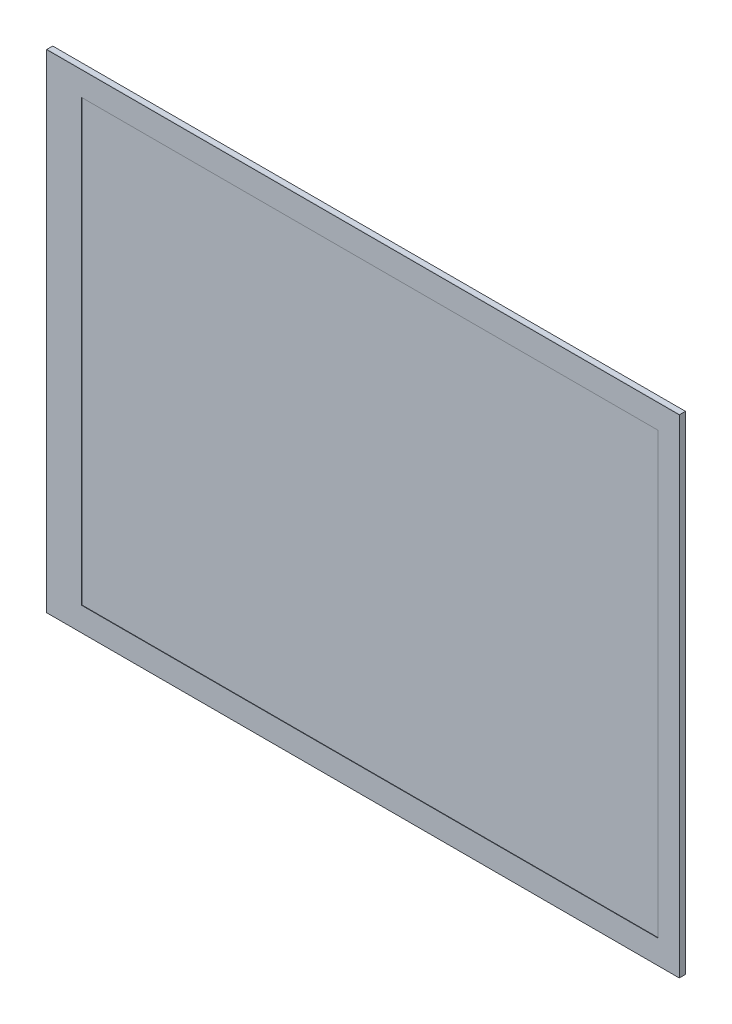
ISO-10303-21;
HEADER;
FILE_DESCRIPTION(('STEP AP214'),'2;1');
FILE_NAME('part.step','',(''),(''),'','','');
FILE_SCHEMA(('AUTOMOTIVE_DESIGN { 1 0 10303 214 1 1 1 1 }'));
ENDSEC;
DATA;
#1=APPLICATION_CONTEXT('core data for automotive mechanical design processes');
#2=APPLICATION_PROTOCOL_DEFINITION('international standard','automotive_design',2000,#1);
#3=PRODUCT_CONTEXT('',#1,'mechanical');
#4=PRODUCT('Part','Part','',(#3));
#5=PRODUCT_RELATED_PRODUCT_CATEGORY('part','',(#4));
#6=PRODUCT_DEFINITION_FORMATION('','',#4);
#7=PRODUCT_DEFINITION_CONTEXT('part definition',#1,'design');
#8=PRODUCT_DEFINITION('design','',#6,#7);
#9=PRODUCT_DEFINITION_SHAPE('','',#8);
#10=(LENGTH_UNIT() NAMED_UNIT(*) SI_UNIT(.MILLI.,.METRE.));
#11=(NAMED_UNIT(*) PLANE_ANGLE_UNIT() SI_UNIT($,.RADIAN.));
#12=(NAMED_UNIT(*) SI_UNIT($,.STERADIAN.) SOLID_ANGLE_UNIT());
#13=UNCERTAINTY_MEASURE_WITH_UNIT(LENGTH_MEASURE(1.E-05),#10,'distance_accuracy_value','');
#14=(GEOMETRIC_REPRESENTATION_CONTEXT(3) GLOBAL_UNCERTAINTY_ASSIGNED_CONTEXT((#13)) GLOBAL_UNIT_ASSIGNED_CONTEXT((#10,
#11,#12)) REPRESENTATION_CONTEXT('',''));
#15=CARTESIAN_POINT('',(0.,0.,0.));
#16=DIRECTION('',(0.,0.,1.));
#17=DIRECTION('',(1.,0.,0.));
#18=AXIS2_PLACEMENT_3D('',#15,#16,#17);
#19=CARTESIAN_POINT('',(0.2,44.5,1.4));
#20=DIRECTION('',(0.,0.,-1.));
#21=DIRECTION('',(-1.,0.,0.));
#22=AXIS2_PLACEMENT_3D('',#19,#20,#21);
#23=PLANE('',#22);
#24=DIRECTION('',(-1.,0.,0.));
#25=VECTOR('',#24,1.);
#26=CARTESIAN_POINT('',(0.2,44.5,1.4));
#27=LINE('',#26,#25);
#28=CARTESIAN_POINT('',(0.2,44.5,1.4));
#29=VERTEX_POINT('',#28);
#30=CARTESIAN_POINT('',(0.1,44.5,1.4));
#31=VERTEX_POINT('',#30);
#32=EDGE_CURVE('E209',#29,#31,#27,.T.);
#33=ORIENTED_EDGE('',*,*,#32,.F.);
#34=DIRECTION('',(0.,1.,0.));
#35=VECTOR('',#34,1.);
#36=CARTESIAN_POINT('',(0.2,66.5,1.4));
#37=LINE('',#36,#35);
#38=CARTESIAN_POINT('',(0.2,66.5,1.4));
#39=VERTEX_POINT('',#38);
#40=EDGE_CURVE('E12',#29,#39,#37,.T.);
#41=ORIENTED_EDGE('',*,*,#40,.T.);
#42=DIRECTION('',(-1.,0.,0.));
#43=VECTOR('',#42,1.);
#44=CARTESIAN_POINT('',(0.2,66.5,1.4));
#45=LINE('',#44,#43);
#46=CARTESIAN_POINT('',(0.1,66.5,1.4));
#47=VERTEX_POINT('',#46);
#48=EDGE_CURVE('E47',#39,#47,#45,.T.);
#49=ORIENTED_EDGE('',*,*,#48,.T.);
#50=DIRECTION('',(0.,1.,0.));
#51=VECTOR('',#50,1.);
#52=CARTESIAN_POINT('',(0.1,111.,1.4));
#53=LINE('',#52,#51);
#54=EDGE_CURVE('E231',#31,#47,#53,.T.);
#55=ORIENTED_EDGE('',*,*,#54,.F.);
#56=EDGE_LOOP('',(#33,#41,#49,#55));
#57=FACE_BOUND('',#56,.T.);
#58=ADVANCED_FACE('F44',(#57),#23,.F.);
#59=CARTESIAN_POINT('',(0.1,111.,1.4));
#60=DIRECTION('',(1.,0.,0.));
#61=DIRECTION('',(0.,0.,-1.));
#62=AXIS2_PLACEMENT_3D('',#59,#60,#61);
#63=PLANE('',#62);
#64=DIRECTION('',(0.,0.,1.));
#65=VECTOR('',#64,1.);
#66=CARTESIAN_POINT('',(0.1,44.5,1.4));
#67=LINE('',#66,#65);
#68=CARTESIAN_POINT('',(0.10000000000001,44.5000000000001,-1.6));
#69=VERTEX_POINT('',#68);
#70=EDGE_CURVE('E152',#69,#31,#67,.T.);
#71=ORIENTED_EDGE('',*,*,#70,.T.);
#72=ORIENTED_EDGE('',*,*,#54,.T.);
#73=DIRECTION('',(0.,0.,-1.));
#74=VECTOR('',#73,1.);
#75=CARTESIAN_POINT('',(0.1,66.5,1.4));
#76=LINE('',#75,#74);
#77=CARTESIAN_POINT('',(0.10000000000001,66.5000000000001,-1.6));
#78=VERTEX_POINT('',#77);
#79=EDGE_CURVE('E184',#47,#78,#76,.T.);
#80=ORIENTED_EDGE('',*,*,#79,.T.);
#81=CARTESIAN_POINT('',(0.10000000000001,65.5000000000001,-1.6));
#82=DIRECTION('',(-1.,0.,0.));
#83=DIRECTION('',(0.,0.,-1.));
#84=AXIS2_PLACEMENT_3D('',#81,#82,#83);
#85=CIRCLE('',#84,1.);
#86=CARTESIAN_POINT('',(0.100000000000014,65.5000000000001,-2.6));
#87=VERTEX_POINT('',#86);
#88=EDGE_CURVE('E139',#78,#87,#85,.T.);
#89=ORIENTED_EDGE('',*,*,#88,.T.);
#90=DIRECTION('',(0.,-1.,0.));
#91=VECTOR('',#90,1.);
#92=CARTESIAN_POINT('',(0.100000000000014,65.5000000000001,-2.59999999999999));
#93=LINE('',#92,#91);
#94=CARTESIAN_POINT('',(0.100000000000014,59.0000000000001,-2.6));
#95=VERTEX_POINT('',#94);
#96=EDGE_CURVE('E183',#87,#95,#93,.T.);
#97=ORIENTED_EDGE('',*,*,#96,.T.);
#98=CARTESIAN_POINT('',(0.100000000000018,59.0000000000001,-3.6));
#99=DIRECTION('',(1.,0.,0.));
#100=DIRECTION('',(0.,0.,1.));
#101=AXIS2_PLACEMENT_3D('',#98,#99,#100);
#102=CIRCLE('',#101,1.);
#103=CARTESIAN_POINT('',(0.100000000000018,58.0000000000001,-3.6));
#104=VERTEX_POINT('',#103);
#105=EDGE_CURVE('E187',#95,#104,#102,.T.);
#106=ORIENTED_EDGE('',*,*,#105,.T.);
#107=DIRECTION('',(0.,0.,-1.));
#108=VECTOR('',#107,1.);
#109=CARTESIAN_POINT('',(0.100000000000018,58.0000000000001,-3.6));
#110=LINE('',#109,#108);
#111=CARTESIAN_POINT('',(0.100000000000035,58.,-8.6));
#112=VERTEX_POINT('',#111);
#113=EDGE_CURVE('E190',#104,#112,#110,.T.);
#114=ORIENTED_EDGE('',*,*,#113,.T.);
#115=DIRECTION('',(0.,-1.,0.));
#116=VECTOR('',#115,1.);
#117=CARTESIAN_POINT('',(0.100000000000035,58.,-8.6));
#118=LINE('',#117,#116);
#119=CARTESIAN_POINT('',(0.100000000000035,53.,-8.6));
#120=VERTEX_POINT('',#119);
#121=EDGE_CURVE('E193',#112,#120,#118,.T.);
#122=ORIENTED_EDGE('',*,*,#121,.T.);
#123=DIRECTION('',(0.,0.,1.));
#124=VECTOR('',#123,1.);
#125=CARTESIAN_POINT('',(0.100000000000035,53.,-8.6));
#126=LINE('',#125,#124);
#127=CARTESIAN_POINT('',(0.100000000000018,53.0000000000001,-3.6));
#128=VERTEX_POINT('',#127);
#129=EDGE_CURVE('E196',#120,#128,#126,.T.);
#130=ORIENTED_EDGE('',*,*,#129,.T.);
#131=CARTESIAN_POINT('',(0.100000000000018,52.0000000000001,-3.6));
#132=DIRECTION('',(1.,0.,0.));
#133=DIRECTION('',(0.,0.,1.));
#134=AXIS2_PLACEMENT_3D('',#131,#132,#133);
#135=CIRCLE('',#134,1.);
#136=CARTESIAN_POINT('',(0.100000000000014,52.0000000000001,-2.59999999999999));
#137=VERTEX_POINT('',#136);
#138=EDGE_CURVE('E199',#128,#137,#135,.T.);
#139=ORIENTED_EDGE('',*,*,#138,.T.);
#140=DIRECTION('',(0.,-1.,0.));
#141=VECTOR('',#140,1.);
#142=CARTESIAN_POINT('',(0.100000000000014,52.0000000000001,-2.6));
#143=LINE('',#142,#141);
#144=CARTESIAN_POINT('',(0.100000000000014,45.5000000000001,-2.59999999999999));
#145=VERTEX_POINT('',#144);
#146=EDGE_CURVE('E202',#137,#145,#143,.T.);
#147=ORIENTED_EDGE('',*,*,#146,.T.);
#148=CARTESIAN_POINT('',(0.10000000000001,45.5000000000001,-1.6));
#149=DIRECTION('',(-1.,0.,0.));
#150=DIRECTION('',(0.,0.,-1.));
#151=AXIS2_PLACEMENT_3D('',#148,#149,#150);
#152=CIRCLE('',#151,1.);
#153=EDGE_CURVE('E155',#145,#69,#152,.T.);
#154=ORIENTED_EDGE('',*,*,#153,.T.);
#155=EDGE_LOOP('',(#71,#72,#80,#89,#97,#106,#114,#122,#130,#139,#147,#154));
#156=FACE_BOUND('',#155,.T.);
#157=ADVANCED_FACE('F239',(#156),#63,.F.);
#158=CARTESIAN_POINT('',(0.2,66.5,1.4));
#159=DIRECTION('',(0.,1.,0.));
#160=DIRECTION('',(0.,0.,-1.));
#161=AXIS2_PLACEMENT_3D('',#158,#159,#160);
#162=PLANE('',#161);
#163=ORIENTED_EDGE('',*,*,#79,.F.);
#164=ORIENTED_EDGE('',*,*,#48,.F.);
#165=DIRECTION('',(0.,0.,-1.));
#166=VECTOR('',#165,1.);
#167=CARTESIAN_POINT('',(0.2,66.5,1.4));
#168=LINE('',#167,#166);
#169=CARTESIAN_POINT('',(0.200000000000011,66.5000000000001,-1.6));
#170=VERTEX_POINT('',#169);
#171=EDGE_CURVE('E146',#39,#170,#168,.T.);
#172=ORIENTED_EDGE('',*,*,#171,.T.);
#173=DIRECTION('',(-1.,0.,0.));
#174=VECTOR('',#173,1.);
#175=CARTESIAN_POINT('',(0.200000000000011,66.5000000000001,-1.6));
#176=LINE('',#175,#174);
#177=EDGE_CURVE('E134',#170,#78,#176,.T.);
#178=ORIENTED_EDGE('',*,*,#177,.T.);
#179=EDGE_LOOP('',(#163,#164,#172,#178));
#180=FACE_BOUND('',#179,.T.);
#181=ADVANCED_FACE('F151',(#180),#162,.T.);
#182=CARTESIAN_POINT('',(0.200000000000011,65.5000000000001,-1.6));
#183=DIRECTION('',(-1.,0.,0.));
#184=DIRECTION('',(0.,0.,1.));
#185=AXIS2_PLACEMENT_3D('',#182,#183,#184);
#186=CYLINDRICAL_SURFACE('',#185,1.);
#187=ORIENTED_EDGE('',*,*,#88,.F.);
#188=ORIENTED_EDGE('',*,*,#177,.F.);
#189=CARTESIAN_POINT('',(0.200000000000011,65.5000000000001,-1.6));
#190=DIRECTION('',(-1.,0.,0.));
#191=DIRECTION('',(0.,0.,-1.));
#192=AXIS2_PLACEMENT_3D('',#189,#190,#191);
#193=CIRCLE('',#192,1.);
#194=CARTESIAN_POINT('',(0.200000000000014,65.5000000000001,-2.6));
#195=VERTEX_POINT('',#194);
#196=EDGE_CURVE('E137',#170,#195,#193,.T.);
#197=ORIENTED_EDGE('',*,*,#196,.T.);
#198=DIRECTION('',(-1.,0.,0.));
#199=VECTOR('',#198,1.);
#200=CARTESIAN_POINT('',(0.200000000000014,65.5000000000001,-2.6));
#201=LINE('',#200,#199);
#202=EDGE_CURVE('E141',#195,#87,#201,.T.);
#203=ORIENTED_EDGE('',*,*,#202,.T.);
#204=EDGE_LOOP('',(#187,#188,#197,#203));
#205=FACE_BOUND('',#204,.T.);
#206=ADVANCED_FACE('F136',(#205),#186,.T.);
#207=CARTESIAN_POINT('',(0.200000000000014,65.5000000000001,-2.59999999999999));
#208=DIRECTION('',(0.,0.,-1.));
#209=DIRECTION('',(0.,-1.,0.));
#210=AXIS2_PLACEMENT_3D('',#207,#208,#209);
#211=PLANE('',#210);
#212=ORIENTED_EDGE('',*,*,#96,.F.);
#213=ORIENTED_EDGE('',*,*,#202,.F.);
#214=DIRECTION('',(0.,-1.,0.));
#215=VECTOR('',#214,1.);
#216=CARTESIAN_POINT('',(0.200000000000014,65.5000000000001,-2.59999999999999));
#217=LINE('',#216,#215);
#218=CARTESIAN_POINT('',(0.200000000000014,59.0000000000001,-2.6));
#219=VERTEX_POINT('',#218);
#220=EDGE_CURVE('E149',#195,#219,#217,.T.);
#221=ORIENTED_EDGE('',*,*,#220,.T.);
#222=DIRECTION('',(-1.,0.,0.));
#223=VECTOR('',#222,1.);
#224=CARTESIAN_POINT('',(0.200000000000014,59.0000000000001,-2.6));
#225=LINE('',#224,#223);
#226=EDGE_CURVE('E222',#219,#95,#225,.T.);
#227=ORIENTED_EDGE('',*,*,#226,.T.);
#228=EDGE_LOOP('',(#212,#213,#221,#227));
#229=FACE_BOUND('',#228,.T.);
#230=ADVANCED_FACE('F243',(#229),#211,.T.);
#231=CARTESIAN_POINT('',(0.200000000000018,59.0000000000001,-3.6));
#232=DIRECTION('',(-1.,0.,0.));
#233=DIRECTION('',(0.,0.,1.));
#234=AXIS2_PLACEMENT_3D('',#231,#232,#233);
#235=CYLINDRICAL_SURFACE('',#234,1.);
#236=ORIENTED_EDGE('',*,*,#105,.F.);
#237=ORIENTED_EDGE('',*,*,#226,.F.);
#238=CARTESIAN_POINT('',(0.200000000000018,59.0000000000001,-3.6));
#239=DIRECTION('',(1.,0.,0.));
#240=DIRECTION('',(0.,0.,1.));
#241=AXIS2_PLACEMENT_3D('',#238,#239,#240);
#242=CIRCLE('',#241,1.);
#243=CARTESIAN_POINT('',(0.200000000000018,58.0000000000001,-3.6));
#244=VERTEX_POINT('',#243);
#245=EDGE_CURVE('E159',#219,#244,#242,.T.);
#246=ORIENTED_EDGE('',*,*,#245,.T.);
#247=DIRECTION('',(-1.,0.,0.));
#248=VECTOR('',#247,1.);
#249=CARTESIAN_POINT('',(0.200000000000018,58.0000000000001,-3.6));
#250=LINE('',#249,#248);
#251=EDGE_CURVE('E220',#244,#104,#250,.T.);
#252=ORIENTED_EDGE('',*,*,#251,.T.);
#253=EDGE_LOOP('',(#236,#237,#246,#252));
#254=FACE_BOUND('',#253,.T.);
#255=ADVANCED_FACE('F245',(#254),#235,.F.);
#256=CARTESIAN_POINT('',(0.200000000000018,58.0000000000001,-3.6));
#257=DIRECTION('',(0.,1.,0.));
#258=DIRECTION('',(0.,0.,-1.));
#259=AXIS2_PLACEMENT_3D('',#256,#257,#258);
#260=PLANE('',#259);
#261=ORIENTED_EDGE('',*,*,#113,.F.);
#262=ORIENTED_EDGE('',*,*,#251,.F.);
#263=DIRECTION('',(0.,0.,-1.));
#264=VECTOR('',#263,1.);
#265=CARTESIAN_POINT('',(0.200000000000018,58.0000000000001,-3.6));
#266=LINE('',#265,#264);
#267=CARTESIAN_POINT('',(0.200000000000035,58.,-8.6));
#268=VERTEX_POINT('',#267);
#269=EDGE_CURVE('E162',#244,#268,#266,.T.);
#270=ORIENTED_EDGE('',*,*,#269,.T.);
#271=DIRECTION('',(-1.,0.,0.));
#272=VECTOR('',#271,1.);
#273=CARTESIAN_POINT('',(0.200000000000035,58.,-8.6));
#274=LINE('',#273,#272);
#275=EDGE_CURVE('E218',#268,#112,#274,.T.);
#276=ORIENTED_EDGE('',*,*,#275,.T.);
#277=EDGE_LOOP('',(#261,#262,#270,#276));
#278=FACE_BOUND('',#277,.T.);
#279=ADVANCED_FACE('F249',(#278),#260,.T.);
#280=CARTESIAN_POINT('',(0.200000000000035,58.,-8.6));
#281=DIRECTION('',(0.,0.,-1.));
#282=DIRECTION('',(-1.,0.,0.));
#283=AXIS2_PLACEMENT_3D('',#280,#281,#282);
#284=PLANE('',#283);
#285=ORIENTED_EDGE('',*,*,#121,.F.);
#286=ORIENTED_EDGE('',*,*,#275,.F.);
#287=DIRECTION('',(0.,-1.,0.));
#288=VECTOR('',#287,1.);
#289=CARTESIAN_POINT('',(0.200000000000035,58.,-8.6));
#290=LINE('',#289,#288);
#291=CARTESIAN_POINT('',(0.200000000000035,53.,-8.6));
#292=VERTEX_POINT('',#291);
#293=EDGE_CURVE('E165',#268,#292,#290,.T.);
#294=ORIENTED_EDGE('',*,*,#293,.T.);
#295=DIRECTION('',(-1.,0.,0.));
#296=VECTOR('',#295,1.);
#297=CARTESIAN_POINT('',(0.200000000000035,53.,-8.6));
#298=LINE('',#297,#296);
#299=EDGE_CURVE('E216',#292,#120,#298,.T.);
#300=ORIENTED_EDGE('',*,*,#299,.T.);
#301=EDGE_LOOP('',(#285,#286,#294,#300));
#302=FACE_BOUND('',#301,.T.);
#303=ADVANCED_FACE('F253',(#302),#284,.T.);
#304=CARTESIAN_POINT('',(0.200000000000035,53.,-8.6));
#305=DIRECTION('',(0.,-1.,0.));
#306=DIRECTION('',(0.,0.,1.));
#307=AXIS2_PLACEMENT_3D('',#304,#305,#306);
#308=PLANE('',#307);
#309=ORIENTED_EDGE('',*,*,#129,.F.);
#310=ORIENTED_EDGE('',*,*,#299,.F.);
#311=DIRECTION('',(0.,0.,1.));
#312=VECTOR('',#311,1.);
#313=CARTESIAN_POINT('',(0.200000000000035,53.,-8.6));
#314=LINE('',#313,#312);
#315=CARTESIAN_POINT('',(0.200000000000018,53.0000000000001,-3.6));
#316=VERTEX_POINT('',#315);
#317=EDGE_CURVE('E168',#292,#316,#314,.T.);
#318=ORIENTED_EDGE('',*,*,#317,.T.);
#319=DIRECTION('',(-1.,0.,0.));
#320=VECTOR('',#319,1.);
#321=CARTESIAN_POINT('',(0.200000000000018,53.0000000000001,-3.6));
#322=LINE('',#321,#320);
#323=EDGE_CURVE('E214',#316,#128,#322,.T.);
#324=ORIENTED_EDGE('',*,*,#323,.T.);
#325=EDGE_LOOP('',(#309,#310,#318,#324));
#326=FACE_BOUND('',#325,.T.);
#327=ADVANCED_FACE('F257',(#326),#308,.T.);
#328=CARTESIAN_POINT('',(0.200000000000018,52.0000000000001,-3.6));
#329=DIRECTION('',(-1.,0.,0.));
#330=DIRECTION('',(0.,0.,1.));
#331=AXIS2_PLACEMENT_3D('',#328,#329,#330);
#332=CYLINDRICAL_SURFACE('',#331,1.);
#333=ORIENTED_EDGE('',*,*,#138,.F.);
#334=ORIENTED_EDGE('',*,*,#323,.F.);
#335=CARTESIAN_POINT('',(0.200000000000018,52.0000000000001,-3.6));
#336=DIRECTION('',(1.,0.,0.));
#337=DIRECTION('',(0.,0.,1.));
#338=AXIS2_PLACEMENT_3D('',#335,#336,#337);
#339=CIRCLE('',#338,1.);
#340=CARTESIAN_POINT('',(0.200000000000014,52.0000000000001,-2.59999999999999));
#341=VERTEX_POINT('',#340);
#342=EDGE_CURVE('E171',#316,#341,#339,.T.);
#343=ORIENTED_EDGE('',*,*,#342,.T.);
#344=DIRECTION('',(-1.,0.,0.));
#345=VECTOR('',#344,1.);
#346=CARTESIAN_POINT('',(0.200000000000014,52.0000000000001,-2.59999999999999));
#347=LINE('',#346,#345);
#348=EDGE_CURVE('E212',#341,#137,#347,.T.);
#349=ORIENTED_EDGE('',*,*,#348,.T.);
#350=EDGE_LOOP('',(#333,#334,#343,#349));
#351=FACE_BOUND('',#350,.T.);
#352=ADVANCED_FACE('F261',(#351),#332,.F.);
#353=CARTESIAN_POINT('',(0.200000000000014,52.0000000000001,-2.6));
#354=DIRECTION('',(0.,0.,-1.));
#355=DIRECTION('',(0.,-1.,0.));
#356=AXIS2_PLACEMENT_3D('',#353,#354,#355);
#357=PLANE('',#356);
#358=ORIENTED_EDGE('',*,*,#146,.F.);
#359=ORIENTED_EDGE('',*,*,#348,.F.);
#360=DIRECTION('',(0.,-1.,0.));
#361=VECTOR('',#360,1.);
#362=CARTESIAN_POINT('',(0.200000000000014,52.0000000000001,-2.6));
#363=LINE('',#362,#361);
#364=CARTESIAN_POINT('',(0.200000000000014,45.5000000000001,-2.59999999999999));
#365=VERTEX_POINT('',#364);
#366=EDGE_CURVE('E174',#341,#365,#363,.T.);
#367=ORIENTED_EDGE('',*,*,#366,.T.);
#368=DIRECTION('',(-1.,0.,0.));
#369=VECTOR('',#368,1.);
#370=CARTESIAN_POINT('',(0.200000000000014,45.5000000000001,-2.59999999999999));
#371=LINE('',#370,#369);
#372=EDGE_CURVE('E210',#365,#145,#371,.T.);
#373=ORIENTED_EDGE('',*,*,#372,.T.);
#374=EDGE_LOOP('',(#358,#359,#367,#373));
#375=FACE_BOUND('',#374,.T.);
#376=ADVANCED_FACE('F266',(#375),#357,.T.);
#377=CARTESIAN_POINT('',(0.200000000000011,45.5000000000001,-1.6));
#378=DIRECTION('',(-1.,0.,0.));
#379=DIRECTION('',(0.,0.,1.));
#380=AXIS2_PLACEMENT_3D('',#377,#378,#379);
#381=CYLINDRICAL_SURFACE('',#380,1.);
#382=ORIENTED_EDGE('',*,*,#153,.F.);
#383=ORIENTED_EDGE('',*,*,#372,.F.);
#384=CARTESIAN_POINT('',(0.200000000000011,45.5000000000001,-1.6));
#385=DIRECTION('',(-1.,0.,0.));
#386=DIRECTION('',(0.,0.,-1.));
#387=AXIS2_PLACEMENT_3D('',#384,#385,#386);
#388=CIRCLE('',#387,1.);
#389=CARTESIAN_POINT('',(0.200000000000011,44.5000000000001,-1.6));
#390=VERTEX_POINT('',#389);
#391=EDGE_CURVE('E177',#365,#390,#388,.T.);
#392=ORIENTED_EDGE('',*,*,#391,.T.);
#393=DIRECTION('',(-1.,0.,0.));
#394=VECTOR('',#393,1.);
#395=CARTESIAN_POINT('',(0.200000000000011,44.5000000000001,-1.6));
#396=LINE('',#395,#394);
#397=EDGE_CURVE('E207',#390,#69,#396,.T.);
#398=ORIENTED_EDGE('',*,*,#397,.T.);
#399=EDGE_LOOP('',(#382,#383,#392,#398));
#400=FACE_BOUND('',#399,.T.);
#401=ADVANCED_FACE('F270',(#400),#381,.T.);
#402=CARTESIAN_POINT('',(0.2,44.5,1.4));
#403=DIRECTION('',(0.,-1.,0.));
#404=DIRECTION('',(0.,0.,1.));
#405=AXIS2_PLACEMENT_3D('',#402,#403,#404);
#406=PLANE('',#405);
#407=ORIENTED_EDGE('',*,*,#70,.F.);
#408=ORIENTED_EDGE('',*,*,#397,.F.);
#409=DIRECTION('',(0.,0.,1.));
#410=VECTOR('',#409,1.);
#411=CARTESIAN_POINT('',(0.2,44.5,1.4));
#412=LINE('',#411,#410);
#413=EDGE_CURVE('E142',#390,#29,#412,.T.);
#414=ORIENTED_EDGE('',*,*,#413,.T.);
#415=ORIENTED_EDGE('',*,*,#32,.T.);
#416=EDGE_LOOP('',(#407,#408,#414,#415));
#417=FACE_BOUND('',#416,.T.);
#418=ADVANCED_FACE('F272',(#417),#406,.T.);
#419=CARTESIAN_POINT('',(0.200000000000011,45.5000000000001,-1.6));
#420=DIRECTION('',(1.,0.,0.));
#421=DIRECTION('',(0.,0.,-1.));
#422=AXIS2_PLACEMENT_3D('',#419,#420,#421);
#423=PLANE('',#422);
#424=ORIENTED_EDGE('',*,*,#40,.F.);
#425=ORIENTED_EDGE('',*,*,#413,.F.);
#426=ORIENTED_EDGE('',*,*,#391,.F.);
#427=ORIENTED_EDGE('',*,*,#366,.F.);
#428=ORIENTED_EDGE('',*,*,#342,.F.);
#429=ORIENTED_EDGE('',*,*,#317,.F.);
#430=ORIENTED_EDGE('',*,*,#293,.F.);
#431=ORIENTED_EDGE('',*,*,#269,.F.);
#432=ORIENTED_EDGE('',*,*,#245,.F.);
#433=ORIENTED_EDGE('',*,*,#220,.F.);
#434=ORIENTED_EDGE('',*,*,#196,.F.);
#435=ORIENTED_EDGE('',*,*,#171,.F.);
#436=EDGE_LOOP('',(#424,#425,#426,#427,#428,#429,#430,#431,#432,#433,#434,#435));
#437=FACE_BOUND('',#436,.T.);
#438=ADVANCED_FACE('F145',(#437),#423,.T.);
#439=CLOSED_SHELL('',(#58,#157,#181,#206,#230,#255,#279,#303,#327,#352,#376,#401,#418,#438));
#440=MANIFOLD_SOLID_BREP('B2',#439);
#441=CARTESIAN_POINT('',(0.,44.5,1.2));
#442=DIRECTION('',(-1.,0.,0.));
#443=DIRECTION('',(0.,0.,1.));
#444=AXIS2_PLACEMENT_3D('',#441,#442,#443);
#445=PLANE('',#444);
#446=DIRECTION('',(0.,-1.,0.));
#447=VECTOR('',#446,1.);
#448=CARTESIAN_POINT('',(0.,0.,1.3));
#449=LINE('',#448,#447);
#450=CARTESIAN_POINT('',(0.,111.,1.3));
#451=VERTEX_POINT('',#450);
#452=CARTESIAN_POINT('',(0.,0.,1.3));
#453=VERTEX_POINT('',#452);
#454=EDGE_CURVE('E436',#451,#453,#449,.T.);
#455=ORIENTED_EDGE('',*,*,#454,.F.);
#456=DIRECTION('',(0.,0.,-1.));
#457=VECTOR('',#456,1.);
#458=CARTESIAN_POINT('',(0.,111.,1.3));
#459=LINE('',#458,#457);
#460=CARTESIAN_POINT('',(0.,111.,0.));
#461=VERTEX_POINT('',#460);
#462=EDGE_CURVE('E458',#451,#461,#459,.T.);
#463=ORIENTED_EDGE('',*,*,#462,.T.);
#464=DIRECTION('',(0.,-1.,0.));
#465=VECTOR('',#464,1.);
#466=CARTESIAN_POINT('',(0.,0.,0.));
#467=LINE('',#466,#465);
#468=CARTESIAN_POINT('',(0.,0.,0.));
#469=VERTEX_POINT('',#468);
#470=EDGE_CURVE('E42',#461,#469,#467,.T.);
#471=ORIENTED_EDGE('',*,*,#470,.T.);
#472=DIRECTION('',(0.,0.,-1.));
#473=VECTOR('',#472,1.);
#474=CARTESIAN_POINT('',(0.,0.,1.3));
#475=LINE('',#474,#473);
#476=EDGE_CURVE('E470',#453,#469,#475,.T.);
#477=ORIENTED_EDGE('',*,*,#476,.F.);
#478=EDGE_LOOP('',(#455,#463,#471,#477));
#479=FACE_BOUND('',#478,.T.);
#480=ADVANCED_FACE('F398',(#479),#445,.T.);
#481=CARTESIAN_POINT('',(0.,111.,1.3));
#482=DIRECTION('',(0.,0.,-1.));
#483=DIRECTION('',(-1.,0.,0.));
#484=AXIS2_PLACEMENT_3D('',#481,#482,#483);
#485=PLANE('',#484);
#486=DIRECTION('',(-1.,0.,0.));
#487=VECTOR('',#486,1.);
#488=CARTESIAN_POINT('',(0.,111.,1.3));
#489=LINE('',#488,#487);
#490=CARTESIAN_POINT('',(144.,111.,1.3));
#491=VERTEX_POINT('',#490);
#492=EDGE_CURVE('E457',#491,#451,#489,.T.);
#493=ORIENTED_EDGE('',*,*,#492,.T.);
#494=ORIENTED_EDGE('',*,*,#454,.T.);
#495=DIRECTION('',(1.,0.,0.));
#496=VECTOR('',#495,1.);
#497=CARTESIAN_POINT('',(0.,0.,1.3));
#498=LINE('',#497,#496);
#499=CARTESIAN_POINT('',(144.,0.,1.3));
#500=VERTEX_POINT('',#499);
#501=EDGE_CURVE('E432',#453,#500,#498,.T.);
#502=ORIENTED_EDGE('',*,*,#501,.T.);
#503=DIRECTION('',(0.,1.,0.));
#504=VECTOR('',#503,1.);
#505=CARTESIAN_POINT('',(144.,0.,1.3));
#506=LINE('',#505,#504);
#507=EDGE_CURVE('E467',#500,#491,#506,.T.);
#508=ORIENTED_EDGE('',*,*,#507,.T.);
#509=EDGE_LOOP('',(#493,#494,#502,#508));
#510=FACE_BOUND('',#509,.T.);
#511=ADVANCED_FACE('F400',(#510),#485,.F.);
#512=CARTESIAN_POINT('',(0.,0.,1.3));
#513=DIRECTION('',(0.,1.,0.));
#514=DIRECTION('',(0.,0.,1.));
#515=AXIS2_PLACEMENT_3D('',#512,#513,#514);
#516=PLANE('',#515);
#517=DIRECTION('',(1.,0.,0.));
#518=VECTOR('',#517,1.);
#519=CARTESIAN_POINT('',(0.,0.,0.));
#520=LINE('',#519,#518);
#521=CARTESIAN_POINT('',(144.,0.,0.));
#522=VERTEX_POINT('',#521);
#523=EDGE_CURVE('E408',#469,#522,#520,.T.);
#524=ORIENTED_EDGE('',*,*,#523,.T.);
#525=DIRECTION('',(0.,0.,-1.));
#526=VECTOR('',#525,1.);
#527=CARTESIAN_POINT('',(144.,0.,1.3));
#528=LINE('',#527,#526);
#529=EDGE_CURVE('E454',#500,#522,#528,.T.);
#530=ORIENTED_EDGE('',*,*,#529,.F.);
#531=ORIENTED_EDGE('',*,*,#501,.F.);
#532=ORIENTED_EDGE('',*,*,#476,.T.);
#533=EDGE_LOOP('',(#524,#530,#531,#532));
#534=FACE_BOUND('',#533,.T.);
#535=ADVANCED_FACE('F474',(#534),#516,.F.);
#536=CARTESIAN_POINT('',(144.,0.,1.3));
#537=DIRECTION('',(-1.,0.,0.));
#538=DIRECTION('',(0.,0.,1.));
#539=AXIS2_PLACEMENT_3D('',#536,#537,#538);
#540=PLANE('',#539);
#541=DIRECTION('',(0.,1.,0.));
#542=VECTOR('',#541,1.);
#543=CARTESIAN_POINT('',(144.,0.,0.));
#544=LINE('',#543,#542);
#545=CARTESIAN_POINT('',(144.,111.,0.));
#546=VERTEX_POINT('',#545);
#547=EDGE_CURVE('E449',#522,#546,#544,.T.);
#548=ORIENTED_EDGE('',*,*,#547,.T.);
#549=DIRECTION('',(0.,0.,-1.));
#550=VECTOR('',#549,1.);
#551=CARTESIAN_POINT('',(144.,111.,1.3));
#552=LINE('',#551,#550);
#553=EDGE_CURVE('E452',#491,#546,#552,.T.);
#554=ORIENTED_EDGE('',*,*,#553,.F.);
#555=ORIENTED_EDGE('',*,*,#507,.F.);
#556=ORIENTED_EDGE('',*,*,#529,.T.);
#557=EDGE_LOOP('',(#548,#554,#555,#556));
#558=FACE_BOUND('',#557,.T.);
#559=ADVANCED_FACE('F450',(#558),#540,.F.);
#560=CARTESIAN_POINT('',(0.,111.,1.3));
#561=DIRECTION('',(0.,-1.,0.));
#562=DIRECTION('',(0.,0.,-1.));
#563=AXIS2_PLACEMENT_3D('',#560,#561,#562);
#564=PLANE('',#563);
#565=DIRECTION('',(-1.,0.,0.));
#566=VECTOR('',#565,1.);
#567=CARTESIAN_POINT('',(0.,111.,0.));
#568=LINE('',#567,#566);
#569=EDGE_CURVE('E443',#546,#461,#568,.T.);
#570=ORIENTED_EDGE('',*,*,#569,.T.);
#571=ORIENTED_EDGE('',*,*,#462,.F.);
#572=ORIENTED_EDGE('',*,*,#492,.F.);
#573=ORIENTED_EDGE('',*,*,#553,.T.);
#574=EDGE_LOOP('',(#570,#571,#572,#573));
#575=FACE_BOUND('',#574,.T.);
#576=ADVANCED_FACE('F456',(#575),#564,.F.);
#577=CARTESIAN_POINT('',(0.,111.,0.));
#578=DIRECTION('',(0.,0.,-1.));
#579=DIRECTION('',(-1.,0.,0.));
#580=AXIS2_PLACEMENT_3D('',#577,#578,#579);
#581=PLANE('',#580);
#582=ORIENTED_EDGE('',*,*,#470,.F.);
#583=ORIENTED_EDGE('',*,*,#569,.F.);
#584=ORIENTED_EDGE('',*,*,#547,.F.);
#585=ORIENTED_EDGE('',*,*,#523,.F.);
#586=EDGE_LOOP('',(#582,#583,#584,#585));
#587=FACE_BOUND('',#586,.T.);
#588=ADVANCED_FACE('F460',(#587),#581,.T.);
#589=CLOSED_SHELL('',(#480,#511,#535,#559,#576,#588));
#590=MANIFOLD_SOLID_BREP('B6',#589);
#591=CARTESIAN_POINT('',(144.,111.,1.4));
#592=DIRECTION('',(0.,0.,1.));
#593=DIRECTION('',(1.,0.,0.));
#594=AXIS2_PLACEMENT_3D('',#591,#592,#593);
#595=PLANE('',#594);
#596=DIRECTION('',(0.,1.,0.));
#597=VECTOR('',#596,1.);
#598=CARTESIAN_POINT('',(144.,0.,1.4));
#599=LINE('',#598,#597);
#600=CARTESIAN_POINT('',(144.,0.,1.4));
#601=VERTEX_POINT('',#600);
#602=CARTESIAN_POINT('',(144.,111.,1.4));
#603=VERTEX_POINT('',#602);
#604=EDGE_CURVE('E631',#601,#603,#599,.T.);
#605=ORIENTED_EDGE('',*,*,#604,.T.);
#606=DIRECTION('',(-1.,0.,0.));
#607=VECTOR('',#606,1.);
#608=CARTESIAN_POINT('',(144.,111.,1.4));
#609=LINE('',#608,#607);
#610=CARTESIAN_POINT('',(0.,111.,1.4));
#611=VERTEX_POINT('',#610);
#612=EDGE_CURVE('E634',#603,#611,#609,.T.);
#613=ORIENTED_EDGE('',*,*,#612,.T.);
#614=DIRECTION('',(0.,-1.,0.));
#615=VECTOR('',#614,1.);
#616=CARTESIAN_POINT('',(0.,111.,1.4));
#617=LINE('',#616,#615);
#618=CARTESIAN_POINT('',(0.,0.,1.4));
#619=VERTEX_POINT('',#618);
#620=EDGE_CURVE('E637',#611,#619,#617,.T.);
#621=ORIENTED_EDGE('',*,*,#620,.T.);
#622=DIRECTION('',(1.,0.,0.));
#623=VECTOR('',#622,1.);
#624=CARTESIAN_POINT('',(0.,0.,1.4));
#625=LINE('',#624,#623);
#626=EDGE_CURVE('E639',#619,#601,#625,.T.);
#627=ORIENTED_EDGE('',*,*,#626,.T.);
#628=EDGE_LOOP('',(#605,#613,#621,#627));
#629=FACE_BOUND('',#628,.T.);
#630=DIRECTION('',(-1.,0.,0.));
#631=VECTOR('',#630,1.);
#632=CARTESIAN_POINT('',(139.2,105.55,1.4));
#633=LINE('',#632,#631);
#634=CARTESIAN_POINT('',(139.2,105.55,1.4));
#635=VERTEX_POINT('',#634);
#636=CARTESIAN_POINT('',(8.00000000000001,105.55,1.4));
#637=VERTEX_POINT('',#636);
#638=EDGE_CURVE('E603',#635,#637,#633,.T.);
#639=ORIENTED_EDGE('',*,*,#638,.F.);
#640=DIRECTION('',(0.,1.,0.));
#641=VECTOR('',#640,1.);
#642=CARTESIAN_POINT('',(139.2,5.45000000000001,1.4));
#643=LINE('',#642,#641);
#644=CARTESIAN_POINT('',(139.2,5.45000000000001,1.4));
#645=VERTEX_POINT('',#644);
#646=EDGE_CURVE('E595',#645,#635,#643,.T.);
#647=ORIENTED_EDGE('',*,*,#646,.F.);
#648=DIRECTION('',(1.,0.,0.));
#649=VECTOR('',#648,1.);
#650=CARTESIAN_POINT('',(8.00000000000001,5.45,1.4));
#651=LINE('',#650,#649);
#652=CARTESIAN_POINT('',(8.00000000000001,5.45,1.4));
#653=VERTEX_POINT('',#652);
#654=EDGE_CURVE('E617',#653,#645,#651,.T.);
#655=ORIENTED_EDGE('',*,*,#654,.F.);
#656=DIRECTION('',(0.,-1.,0.));
#657=VECTOR('',#656,1.);
#658=CARTESIAN_POINT('',(8.00000000000001,105.55,1.4));
#659=LINE('',#658,#657);
#660=EDGE_CURVE('E615',#637,#653,#659,.T.);
#661=ORIENTED_EDGE('',*,*,#660,.F.);
#662=EDGE_LOOP('',(#639,#647,#655,#661));
#663=FACE_BOUND('',#662,.T.);
#664=ADVANCED_FACE('F530',(#629,#663),#595,.T.);
#665=CARTESIAN_POINT('',(144.,111.,1.3));
#666=DIRECTION('',(0.,0.,1.));
#667=DIRECTION('',(1.,0.,0.));
#668=AXIS2_PLACEMENT_3D('',#665,#666,#667);
#669=PLANE('',#668);
#670=DIRECTION('',(0.,1.,0.));
#671=VECTOR('',#670,1.);
#672=CARTESIAN_POINT('',(144.,0.,1.3));
#673=LINE('',#672,#671);
#674=CARTESIAN_POINT('',(144.,0.,1.3));
#675=VERTEX_POINT('',#674);
#676=CARTESIAN_POINT('',(144.,111.,1.3));
#677=VERTEX_POINT('',#676);
#678=EDGE_CURVE('E611',#675,#677,#673,.T.);
#679=ORIENTED_EDGE('',*,*,#678,.F.);
#680=DIRECTION('',(1.,0.,0.));
#681=VECTOR('',#680,1.);
#682=CARTESIAN_POINT('',(0.,0.,1.3));
#683=LINE('',#682,#681);
#684=CARTESIAN_POINT('',(0.,0.,1.3));
#685=VERTEX_POINT('',#684);
#686=EDGE_CURVE('E635',#685,#675,#683,.T.);
#687=ORIENTED_EDGE('',*,*,#686,.F.);
#688=DIRECTION('',(0.,-1.,0.));
#689=VECTOR('',#688,1.);
#690=CARTESIAN_POINT('',(0.,44.5,1.3));
#691=LINE('',#690,#689);
#692=CARTESIAN_POINT('',(0.,111.,1.3));
#693=VERTEX_POINT('',#692);
#694=EDGE_CURVE('E647',#693,#685,#691,.T.);
#695=ORIENTED_EDGE('',*,*,#694,.F.);
#696=DIRECTION('',(-1.,0.,0.));
#697=VECTOR('',#696,1.);
#698=CARTESIAN_POINT('',(144.,111.,1.3));
#699=LINE('',#698,#697);
#700=EDGE_CURVE('E644',#677,#693,#699,.T.);
#701=ORIENTED_EDGE('',*,*,#700,.F.);
#702=EDGE_LOOP('',(#679,#687,#695,#701));
#703=FACE_BOUND('',#702,.T.);
#704=DIRECTION('',(0.,1.,0.));
#705=VECTOR('',#704,1.);
#706=CARTESIAN_POINT('',(139.2,5.45000000000001,1.3));
#707=LINE('',#706,#705);
#708=CARTESIAN_POINT('',(139.2,5.45000000000001,1.3));
#709=VERTEX_POINT('',#708);
#710=CARTESIAN_POINT('',(139.2,105.55,1.3));
#711=VERTEX_POINT('',#710);
#712=EDGE_CURVE('E553',#709,#711,#707,.T.);
#713=ORIENTED_EDGE('',*,*,#712,.T.);
#714=DIRECTION('',(-1.,0.,0.));
#715=VECTOR('',#714,1.);
#716=CARTESIAN_POINT('',(139.2,105.55,1.3));
#717=LINE('',#716,#715);
#718=CARTESIAN_POINT('',(8.00000000000001,105.55,1.3));
#719=VERTEX_POINT('',#718);
#720=EDGE_CURVE('E610',#711,#719,#717,.T.);
#721=ORIENTED_EDGE('',*,*,#720,.T.);
#722=DIRECTION('',(0.,-1.,0.));
#723=VECTOR('',#722,1.);
#724=CARTESIAN_POINT('',(8.00000000000001,105.55,1.3));
#725=LINE('',#724,#723);
#726=CARTESIAN_POINT('',(8.00000000000001,5.45,1.3));
#727=VERTEX_POINT('',#726);
#728=EDGE_CURVE('E623',#719,#727,#725,.T.);
#729=ORIENTED_EDGE('',*,*,#728,.T.);
#730=DIRECTION('',(1.,0.,0.));
#731=VECTOR('',#730,1.);
#732=CARTESIAN_POINT('',(8.00000000000001,5.45,1.3));
#733=LINE('',#732,#731);
#734=EDGE_CURVE('E604',#727,#709,#733,.T.);
#735=ORIENTED_EDGE('',*,*,#734,.T.);
#736=EDGE_LOOP('',(#713,#721,#729,#735));
#737=FACE_BOUND('',#736,.T.);
#738=ADVANCED_FACE('F665',(#703,#737),#669,.F.);
#739=CARTESIAN_POINT('',(144.,0.,1.4));
#740=DIRECTION('',(-1.,0.,0.));
#741=DIRECTION('',(0.,0.,1.));
#742=AXIS2_PLACEMENT_3D('',#739,#740,#741);
#743=PLANE('',#742);
#744=ORIENTED_EDGE('',*,*,#678,.T.);
#745=DIRECTION('',(0.,0.,-1.));
#746=VECTOR('',#745,1.);
#747=CARTESIAN_POINT('',(144.,111.,1.4));
#748=LINE('',#747,#746);
#749=EDGE_CURVE('E396',#603,#677,#748,.T.);
#750=ORIENTED_EDGE('',*,*,#749,.F.);
#751=ORIENTED_EDGE('',*,*,#604,.F.);
#752=DIRECTION('',(0.,0.,-1.));
#753=VECTOR('',#752,1.);
#754=CARTESIAN_POINT('',(144.,0.,1.4));
#755=LINE('',#754,#753);
#756=EDGE_CURVE('E641',#601,#675,#755,.T.);
#757=ORIENTED_EDGE('',*,*,#756,.T.);
#758=EDGE_LOOP('',(#744,#750,#751,#757));
#759=FACE_BOUND('',#758,.T.);
#760=ADVANCED_FACE('F532',(#759),#743,.F.);
#761=CARTESIAN_POINT('',(144.,111.,1.4));
#762=DIRECTION('',(0.,-1.,0.));
#763=DIRECTION('',(0.,0.,-1.));
#764=AXIS2_PLACEMENT_3D('',#761,#762,#763);
#765=PLANE('',#764);
#766=ORIENTED_EDGE('',*,*,#700,.T.);
#767=DIRECTION('',(0.,0.,-1.));
#768=VECTOR('',#767,1.);
#769=CARTESIAN_POINT('',(0.,111.,1.4));
#770=LINE('',#769,#768);
#771=EDGE_CURVE('E538',#611,#693,#770,.T.);
#772=ORIENTED_EDGE('',*,*,#771,.F.);
#773=ORIENTED_EDGE('',*,*,#612,.F.);
#774=ORIENTED_EDGE('',*,*,#749,.T.);
#775=EDGE_LOOP('',(#766,#772,#773,#774));
#776=FACE_BOUND('',#775,.T.);
#777=ADVANCED_FACE('F661',(#776),#765,.F.);
#778=CARTESIAN_POINT('',(0.,44.5,1.4));
#779=DIRECTION('',(1.,0.,0.));
#780=DIRECTION('',(0.,0.,-1.));
#781=AXIS2_PLACEMENT_3D('',#778,#779,#780);
#782=PLANE('',#781);
#783=ORIENTED_EDGE('',*,*,#694,.T.);
#784=DIRECTION('',(0.,0.,-1.));
#785=VECTOR('',#784,1.);
#786=CARTESIAN_POINT('',(0.,0.,1.4));
#787=LINE('',#786,#785);
#788=EDGE_CURVE('E652',#619,#685,#787,.T.);
#789=ORIENTED_EDGE('',*,*,#788,.F.);
#790=ORIENTED_EDGE('',*,*,#620,.F.);
#791=ORIENTED_EDGE('',*,*,#771,.T.);
#792=EDGE_LOOP('',(#783,#789,#790,#791));
#793=FACE_BOUND('',#792,.T.);
#794=ADVANCED_FACE('F658',(#793),#782,.F.);
#795=CARTESIAN_POINT('',(0.,0.,1.4));
#796=DIRECTION('',(0.,1.,0.));
#797=DIRECTION('',(0.,0.,1.));
#798=AXIS2_PLACEMENT_3D('',#795,#796,#797);
#799=PLANE('',#798);
#800=ORIENTED_EDGE('',*,*,#686,.T.);
#801=ORIENTED_EDGE('',*,*,#756,.F.);
#802=ORIENTED_EDGE('',*,*,#626,.F.);
#803=ORIENTED_EDGE('',*,*,#788,.T.);
#804=EDGE_LOOP('',(#800,#801,#802,#803));
#805=FACE_BOUND('',#804,.T.);
#806=ADVANCED_FACE('F670',(#805),#799,.F.);
#807=CARTESIAN_POINT('',(139.2,5.45000000000001,1.4));
#808=DIRECTION('',(-1.,0.,0.));
#809=DIRECTION('',(0.,0.,1.));
#810=AXIS2_PLACEMENT_3D('',#807,#808,#809);
#811=PLANE('',#810);
#812=ORIENTED_EDGE('',*,*,#712,.F.);
#813=DIRECTION('',(0.,0.,-1.));
#814=VECTOR('',#813,1.);
#815=CARTESIAN_POINT('',(139.2,5.45000000000001,1.4));
#816=LINE('',#815,#814);
#817=EDGE_CURVE('E599',#645,#709,#816,.T.);
#818=ORIENTED_EDGE('',*,*,#817,.F.);
#819=ORIENTED_EDGE('',*,*,#646,.T.);
#820=DIRECTION('',(0.,0.,-1.));
#821=VECTOR('',#820,1.);
#822=CARTESIAN_POINT('',(139.2,105.55,1.4));
#823=LINE('',#822,#821);
#824=EDGE_CURVE('E598',#635,#711,#823,.T.);
#825=ORIENTED_EDGE('',*,*,#824,.T.);
#826=EDGE_LOOP('',(#812,#818,#819,#825));
#827=FACE_BOUND('',#826,.T.);
#828=ADVANCED_FACE('F597',(#827),#811,.T.);
#829=CARTESIAN_POINT('',(139.2,105.55,1.4));
#830=DIRECTION('',(0.,-1.,0.));
#831=DIRECTION('',(1.,0.,0.));
#832=AXIS2_PLACEMENT_3D('',#829,#830,#831);
#833=PLANE('',#832);
#834=ORIENTED_EDGE('',*,*,#720,.F.);
#835=ORIENTED_EDGE('',*,*,#824,.F.);
#836=ORIENTED_EDGE('',*,*,#638,.T.);
#837=DIRECTION('',(0.,0.,-1.));
#838=VECTOR('',#837,1.);
#839=CARTESIAN_POINT('',(8.00000000000001,105.55,1.4));
#840=LINE('',#839,#838);
#841=EDGE_CURVE('E612',#637,#719,#840,.T.);
#842=ORIENTED_EDGE('',*,*,#841,.T.);
#843=EDGE_LOOP('',(#834,#835,#836,#842));
#844=FACE_BOUND('',#843,.T.);
#845=ADVANCED_FACE('F607',(#844),#833,.T.);
#846=CARTESIAN_POINT('',(8.00000000000001,105.55,1.4));
#847=DIRECTION('',(1.,0.,0.));
#848=DIRECTION('',(0.,1.,0.));
#849=AXIS2_PLACEMENT_3D('',#846,#847,#848);
#850=PLANE('',#849);
#851=ORIENTED_EDGE('',*,*,#728,.F.);
#852=ORIENTED_EDGE('',*,*,#841,.F.);
#853=ORIENTED_EDGE('',*,*,#660,.T.);
#854=DIRECTION('',(0.,0.,-1.));
#855=VECTOR('',#854,1.);
#856=CARTESIAN_POINT('',(8.00000000000001,5.45,1.4));
#857=LINE('',#856,#855);
#858=EDGE_CURVE('E545',#653,#727,#857,.T.);
#859=ORIENTED_EDGE('',*,*,#858,.T.);
#860=EDGE_LOOP('',(#851,#852,#853,#859));
#861=FACE_BOUND('',#860,.T.);
#862=ADVANCED_FACE('F739',(#861),#850,.T.);
#863=CARTESIAN_POINT('',(8.00000000000001,5.45,1.4));
#864=DIRECTION('',(0.,1.,0.));
#865=DIRECTION('',(-1.,0.,0.));
#866=AXIS2_PLACEMENT_3D('',#863,#864,#865);
#867=PLANE('',#866);
#868=ORIENTED_EDGE('',*,*,#734,.F.);
#869=ORIENTED_EDGE('',*,*,#858,.F.);
#870=ORIENTED_EDGE('',*,*,#654,.T.);
#871=ORIENTED_EDGE('',*,*,#817,.T.);
#872=EDGE_LOOP('',(#868,#869,#870,#871));
#873=FACE_BOUND('',#872,.T.);
#874=ADVANCED_FACE('F746',(#873),#867,.T.);
#875=CLOSED_SHELL('',(#664,#738,#760,#777,#794,#806,#828,#845,#862,#874));
#876=MANIFOLD_SOLID_BREP('B36',#875);
#877=ADVANCED_BREP_SHAPE_REPRESENTATION('',(#18,#440,#590,#876),#14);
#878=SHAPE_DEFINITION_REPRESENTATION(#9,#877);
ENDSEC;
END-ISO-10303-21;
